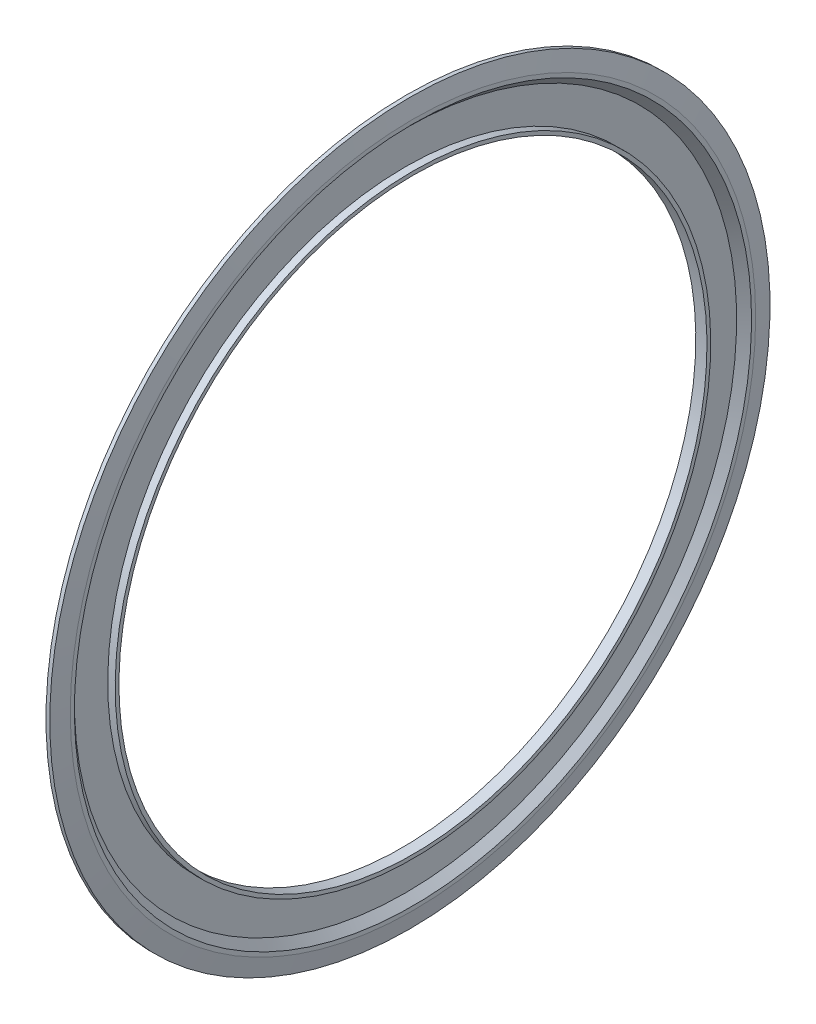
ISO-10303-21;
HEADER;
FILE_DESCRIPTION(('STEP AP214'),'2;1');
FILE_NAME('part.step','',(''),(''),'','','');
FILE_SCHEMA(('AUTOMOTIVE_DESIGN { 1 0 10303 214 1 1 1 1 }'));
ENDSEC;
DATA;
#1=APPLICATION_CONTEXT('core data for automotive mechanical design processes');
#2=APPLICATION_PROTOCOL_DEFINITION('international standard','automotive_design',2000,#1);
#3=PRODUCT_CONTEXT('',#1,'mechanical');
#4=PRODUCT('Part','Part','',(#3));
#5=PRODUCT_RELATED_PRODUCT_CATEGORY('part','',(#4));
#6=PRODUCT_DEFINITION_FORMATION('','',#4);
#7=PRODUCT_DEFINITION_CONTEXT('part definition',#1,'design');
#8=PRODUCT_DEFINITION('design','',#6,#7);
#9=PRODUCT_DEFINITION_SHAPE('','',#8);
#10=(LENGTH_UNIT() NAMED_UNIT(*) SI_UNIT(.MILLI.,.METRE.));
#11=(NAMED_UNIT(*) PLANE_ANGLE_UNIT() SI_UNIT($,.RADIAN.));
#12=(NAMED_UNIT(*) SI_UNIT($,.STERADIAN.) SOLID_ANGLE_UNIT());
#13=UNCERTAINTY_MEASURE_WITH_UNIT(LENGTH_MEASURE(1.E-05),#10,'distance_accuracy_value','');
#14=(GEOMETRIC_REPRESENTATION_CONTEXT(3) GLOBAL_UNCERTAINTY_ASSIGNED_CONTEXT((#13)) GLOBAL_UNIT_ASSIGNED_CONTEXT((#10,
#11,#12)) REPRESENTATION_CONTEXT('',''));
#15=CARTESIAN_POINT('',(0.,0.,0.));
#16=DIRECTION('',(0.,0.,1.));
#17=DIRECTION('',(1.,0.,0.));
#18=AXIS2_PLACEMENT_3D('',#15,#16,#17);
#19=CARTESIAN_POINT('',(1.49640142652533,34.915,0.));
#20=DIRECTION('',(1.,0.,0.));
#21=DIRECTION('',(0.,-1.,0.));
#22=AXIS2_PLACEMENT_3D('',#19,#20,#21);
#23=PLANE('',#22);
#24=CARTESIAN_POINT('',(1.49640142652533,0.,0.));
#25=DIRECTION('',(-1.,0.,0.));
#26=DIRECTION('',(0.,1.,0.));
#27=AXIS2_PLACEMENT_3D('',#24,#25,#26);
#28=CIRCLE('',#27,34.705);
#29=CARTESIAN_POINT('',(1.49640142652533,34.705,0.));
#30=VERTEX_POINT('',#29);
#31=EDGE_CURVE('E11',#30,#30,#28,.T.);
#32=ORIENTED_EDGE('',*,*,#31,.T.);
#33=EDGE_LOOP('',(#32));
#34=FACE_BOUND('',#33,.T.);
#35=CARTESIAN_POINT('',(1.49640142652533,0.,0.));
#36=DIRECTION('',(-1.,0.,0.));
#37=DIRECTION('',(0.,1.,0.));
#38=AXIS2_PLACEMENT_3D('',#35,#36,#37);
#39=CIRCLE('',#38,35.125);
#40=CARTESIAN_POINT('',(1.49640142652533,35.125,0.));
#41=VERTEX_POINT('',#40);
#42=EDGE_CURVE('E48',#41,#41,#39,.T.);
#43=ORIENTED_EDGE('',*,*,#42,.F.);
#44=EDGE_LOOP('',(#43));
#45=FACE_BOUND('',#44,.T.);
#46=ADVANCED_FACE('F16',(#34,#45),#23,.T.);
#47=CARTESIAN_POINT('',(1.11390142652534,0.,0.));
#48=DIRECTION('',(1.,0.,0.));
#49=DIRECTION('',(0.,1.,0.));
#50=AXIS2_PLACEMENT_3D('',#47,#48,#49);
#51=CONICAL_SURFACE('',#50,34.3225,0.78539816339745);
#52=CARTESIAN_POINT('',(0.731401426525338,0.,0.));
#53=DIRECTION('',(-1.,0.,0.));
#54=DIRECTION('',(0.,1.,0.));
#55=AXIS2_PLACEMENT_3D('',#52,#53,#54);
#56=CIRCLE('',#55,33.94);
#57=CARTESIAN_POINT('',(0.731401426525338,33.94,0.));
#58=VERTEX_POINT('',#57);
#59=EDGE_CURVE('E26',#58,#58,#56,.T.);
#60=ORIENTED_EDGE('',*,*,#59,.T.);
#61=EDGE_LOOP('',(#60));
#62=FACE_BOUND('',#61,.T.);
#63=ORIENTED_EDGE('',*,*,#31,.F.);
#64=EDGE_LOOP('',(#63));
#65=FACE_BOUND('',#64,.T.);
#66=ADVANCED_FACE('F18',(#62,#65),#51,.F.);
#67=CARTESIAN_POINT('',(0.731401426525336,32.23,0.));
#68=DIRECTION('',(1.,0.,0.));
#69=DIRECTION('',(0.,-1.,0.));
#70=AXIS2_PLACEMENT_3D('',#67,#68,#69);
#71=PLANE('',#70);
#72=CARTESIAN_POINT('',(0.731401426525336,0.,0.));
#73=DIRECTION('',(-1.,0.,0.));
#74=DIRECTION('',(0.,1.,0.));
#75=AXIS2_PLACEMENT_3D('',#72,#73,#74);
#76=CIRCLE('',#75,30.52);
#77=CARTESIAN_POINT('',(0.731401426525336,30.52,0.));
#78=VERTEX_POINT('',#77);
#79=EDGE_CURVE('E78',#78,#78,#76,.T.);
#80=ORIENTED_EDGE('',*,*,#79,.T.);
#81=EDGE_LOOP('',(#80));
#82=FACE_BOUND('',#81,.T.);
#83=ORIENTED_EDGE('',*,*,#59,.F.);
#84=EDGE_LOOP('',(#83));
#85=FACE_BOUND('',#84,.T.);
#86=ADVANCED_FACE('F91',(#82,#85),#71,.T.);
#87=CARTESIAN_POINT('',(1.11390142652533,0.,0.));
#88=DIRECTION('',(1.,0.,0.));
#89=DIRECTION('',(0.,1.,0.));
#90=AXIS2_PLACEMENT_3D('',#87,#88,#89);
#91=CYLINDRICAL_SURFACE('',#90,30.52);
#92=CARTESIAN_POINT('',(1.49640142652533,0.,0.));
#93=DIRECTION('',(-1.,0.,0.));
#94=DIRECTION('',(0.,1.,0.));
#95=AXIS2_PLACEMENT_3D('',#92,#93,#94);
#96=CIRCLE('',#95,30.52);
#97=CARTESIAN_POINT('',(1.49640142652533,30.52,0.));
#98=VERTEX_POINT('',#97);
#99=EDGE_CURVE('E67',#98,#98,#96,.T.);
#100=ORIENTED_EDGE('',*,*,#99,.T.);
#101=EDGE_LOOP('',(#100));
#102=FACE_BOUND('',#101,.T.);
#103=ORIENTED_EDGE('',*,*,#79,.F.);
#104=EDGE_LOOP('',(#103));
#105=FACE_BOUND('',#104,.T.);
#106=ADVANCED_FACE('F94',(#102,#105),#91,.T.);
#107=CARTESIAN_POINT('',(1.49640142652533,30.32875,0.));
#108=DIRECTION('',(1.,0.,0.));
#109=DIRECTION('',(0.,-1.,0.));
#110=AXIS2_PLACEMENT_3D('',#107,#108,#109);
#111=PLANE('',#110);
#112=CARTESIAN_POINT('',(1.49640142652533,0.,0.));
#113=DIRECTION('',(-1.,0.,0.));
#114=DIRECTION('',(0.,1.,0.));
#115=AXIS2_PLACEMENT_3D('',#112,#113,#114);
#116=CIRCLE('',#115,30.1375);
#117=CARTESIAN_POINT('',(1.49640142652533,30.1375,0.));
#118=VERTEX_POINT('',#117);
#119=EDGE_CURVE('E72',#118,#118,#116,.T.);
#120=ORIENTED_EDGE('',*,*,#119,.T.);
#121=EDGE_LOOP('',(#120));
#122=FACE_BOUND('',#121,.T.);
#123=ORIENTED_EDGE('',*,*,#99,.F.);
#124=EDGE_LOOP('',(#123));
#125=FACE_BOUND('',#124,.T.);
#126=ADVANCED_FACE('F73',(#122,#125),#111,.T.);
#127=CARTESIAN_POINT('',(0.922651426525336,0.,0.));
#128=DIRECTION('',(1.,0.,0.));
#129=DIRECTION('',(0.,1.,0.));
#130=AXIS2_PLACEMENT_3D('',#127,#128,#129);
#131=CYLINDRICAL_SURFACE('',#130,30.1375);
#132=CARTESIAN_POINT('',(0.348901426525336,0.,0.));
#133=DIRECTION('',(-1.,0.,0.));
#134=DIRECTION('',(0.,1.,0.));
#135=AXIS2_PLACEMENT_3D('',#132,#133,#134);
#136=CIRCLE('',#135,30.1375);
#137=CARTESIAN_POINT('',(0.348901426525336,30.1375,0.));
#138=VERTEX_POINT('',#137);
#139=EDGE_CURVE('E76',#138,#138,#136,.T.);
#140=ORIENTED_EDGE('',*,*,#139,.T.);
#141=EDGE_LOOP('',(#140));
#142=FACE_BOUND('',#141,.T.);
#143=ORIENTED_EDGE('',*,*,#119,.F.);
#144=EDGE_LOOP('',(#143));
#145=FACE_BOUND('',#144,.T.);
#146=ADVANCED_FACE('F102',(#142,#145),#131,.F.);
#147=CARTESIAN_POINT('',(0.348901426525338,32.1179683438039,0.));
#148=DIRECTION('',(-1.,0.,0.));
#149=DIRECTION('',(0.,1.,0.));
#150=AXIS2_PLACEMENT_3D('',#147,#148,#149);
#151=PLANE('',#150);
#152=CARTESIAN_POINT('',(0.348901426525338,0.,0.));
#153=DIRECTION('',(-1.,0.,0.));
#154=DIRECTION('',(0.,1.,0.));
#155=AXIS2_PLACEMENT_3D('',#152,#153,#154);
#156=CIRCLE('',#155,34.0984366876077);
#157=CARTESIAN_POINT('',(0.348901426525338,34.0984366876077,0.));
#158=VERTEX_POINT('',#157);
#159=EDGE_CURVE('E80',#158,#158,#156,.T.);
#160=ORIENTED_EDGE('',*,*,#159,.T.);
#161=EDGE_LOOP('',(#160));
#162=FACE_BOUND('',#161,.T.);
#163=ORIENTED_EDGE('',*,*,#139,.F.);
#164=EDGE_LOOP('',(#163));
#165=FACE_BOUND('',#164,.T.);
#166=ADVANCED_FACE('F149',(#162,#165),#151,.T.);
#167=CARTESIAN_POINT('',(0.731401426525336,0.,0.));
#168=DIRECTION('',(1.,0.,0.));
#169=DIRECTION('',(0.,1.,0.));
#170=AXIS2_PLACEMENT_3D('',#167,#168,#169);
#171=CONICAL_SURFACE('',#170,34.4809366876077,0.785398163397446);
#172=CARTESIAN_POINT('',(1.11390142652533,0.,0.));
#173=DIRECTION('',(-1.,0.,0.));
#174=DIRECTION('',(0.,1.,0.));
#175=AXIS2_PLACEMENT_3D('',#172,#173,#174);
#176=CIRCLE('',#175,34.8634366876077);
#177=CARTESIAN_POINT('',(1.11390142652533,34.8634366876077,0.));
#178=VERTEX_POINT('',#177);
#179=EDGE_CURVE('E83',#178,#178,#176,.T.);
#180=ORIENTED_EDGE('',*,*,#179,.T.);
#181=EDGE_LOOP('',(#180));
#182=FACE_BOUND('',#181,.T.);
#183=ORIENTED_EDGE('',*,*,#159,.F.);
#184=EDGE_LOOP('',(#183));
#185=FACE_BOUND('',#184,.T.);
#186=ADVANCED_FACE('F120',(#182,#185),#171,.T.);
#187=CARTESIAN_POINT('',(1.11390142652533,34.9774861369045,0.));
#188=DIRECTION('',(-1.,0.,0.));
#189=DIRECTION('',(0.,1.,0.));
#190=AXIS2_PLACEMENT_3D('',#187,#188,#189);
#191=PLANE('',#190);
#192=CARTESIAN_POINT('',(1.11390142652533,0.,0.));
#193=DIRECTION('',(-1.,0.,0.));
#194=DIRECTION('',(0.,1.,0.));
#195=AXIS2_PLACEMENT_3D('',#192,#193,#194);
#196=CIRCLE('',#195,35.0915355862014);
#197=CARTESIAN_POINT('',(1.11390142652533,35.0915355862014,0.));
#198=VERTEX_POINT('',#197);
#199=EDGE_CURVE('E85',#198,#198,#196,.T.);
#200=ORIENTED_EDGE('',*,*,#199,.T.);
#201=EDGE_LOOP('',(#200));
#202=FACE_BOUND('',#201,.T.);
#203=ORIENTED_EDGE('',*,*,#179,.F.);
#204=EDGE_LOOP('',(#203));
#205=FACE_BOUND('',#204,.T.);
#206=ADVANCED_FACE('F118',(#202,#205),#191,.T.);
#207=CARTESIAN_POINT('',(0.95357925671988,0.,0.));
#208=DIRECTION('',(-1.,0.,0.));
#209=DIRECTION('',(0.,1.,0.));
#210=AXIS2_PLACEMENT_3D('',#207,#208,#209);
#211=CONICAL_SURFACE('',#210,36.0007677931006,1.39626340159546);
#212=CARTESIAN_POINT('',(0.793257086914426,0.,0.));
#213=DIRECTION('',(-1.,0.,0.));
#214=DIRECTION('',(0.,1.,0.));
#215=AXIS2_PLACEMENT_3D('',#212,#213,#214);
#216=CIRCLE('',#215,36.91);
#217=CARTESIAN_POINT('',(0.793257086914426,36.91,0.));
#218=VERTEX_POINT('',#217);
#219=EDGE_CURVE('E20',#218,#218,#216,.T.);
#220=ORIENTED_EDGE('',*,*,#219,.T.);
#221=EDGE_LOOP('',(#220));
#222=FACE_BOUND('',#221,.T.);
#223=ORIENTED_EDGE('',*,*,#199,.F.);
#224=EDGE_LOOP('',(#223));
#225=FACE_BOUND('',#224,.T.);
#226=ADVANCED_FACE('F117',(#222,#225),#211,.F.);
#227=CARTESIAN_POINT('',(0.987457426437576,0.,0.));
#228=DIRECTION('',(1.,0.,0.));
#229=DIRECTION('',(0.,1.,0.));
#230=AXIS2_PLACEMENT_3D('',#227,#228,#229);
#231=CYLINDRICAL_SURFACE('',#230,36.91);
#232=CARTESIAN_POINT('',(1.18165776596073,0.,0.));
#233=DIRECTION('',(-1.,0.,0.));
#234=DIRECTION('',(0.,1.,0.));
#235=AXIS2_PLACEMENT_3D('',#232,#233,#234);
#236=CIRCLE('',#235,36.91);
#237=CARTESIAN_POINT('',(1.18165776596073,36.91,0.));
#238=VERTEX_POINT('',#237);
#239=EDGE_CURVE('E42',#238,#238,#236,.T.);
#240=ORIENTED_EDGE('',*,*,#239,.T.);
#241=EDGE_LOOP('',(#240));
#242=FACE_BOUND('',#241,.T.);
#243=ORIENTED_EDGE('',*,*,#219,.F.);
#244=EDGE_LOOP('',(#243));
#245=FACE_BOUND('',#244,.T.);
#246=ADVANCED_FACE('F113',(#242,#245),#231,.T.);
#247=CARTESIAN_POINT('',(1.33902959624303,0.,0.));
#248=DIRECTION('',(-1.,0.,0.));
#249=DIRECTION('',(0.,1.,0.));
#250=AXIS2_PLACEMENT_3D('',#247,#248,#249);
#251=CONICAL_SURFACE('',#250,36.0175,1.39626340159546);
#252=ORIENTED_EDGE('',*,*,#42,.T.);
#253=EDGE_LOOP('',(#252));
#254=FACE_BOUND('',#253,.T.);
#255=ORIENTED_EDGE('',*,*,#239,.F.);
#256=EDGE_LOOP('',(#255));
#257=FACE_BOUND('',#256,.T.);
#258=ADVANCED_FACE('F116',(#254,#257),#251,.T.);
#259=CLOSED_SHELL('',(#46,#66,#86,#106,#126,#146,#166,#186,#206,#226,#246,#258));
#260=MANIFOLD_SOLID_BREP('B1',#259);
#261=ADVANCED_BREP_SHAPE_REPRESENTATION('',(#18,#260),#14);
#262=SHAPE_DEFINITION_REPRESENTATION(#9,#261);
ENDSEC;
END-ISO-10303-21;
